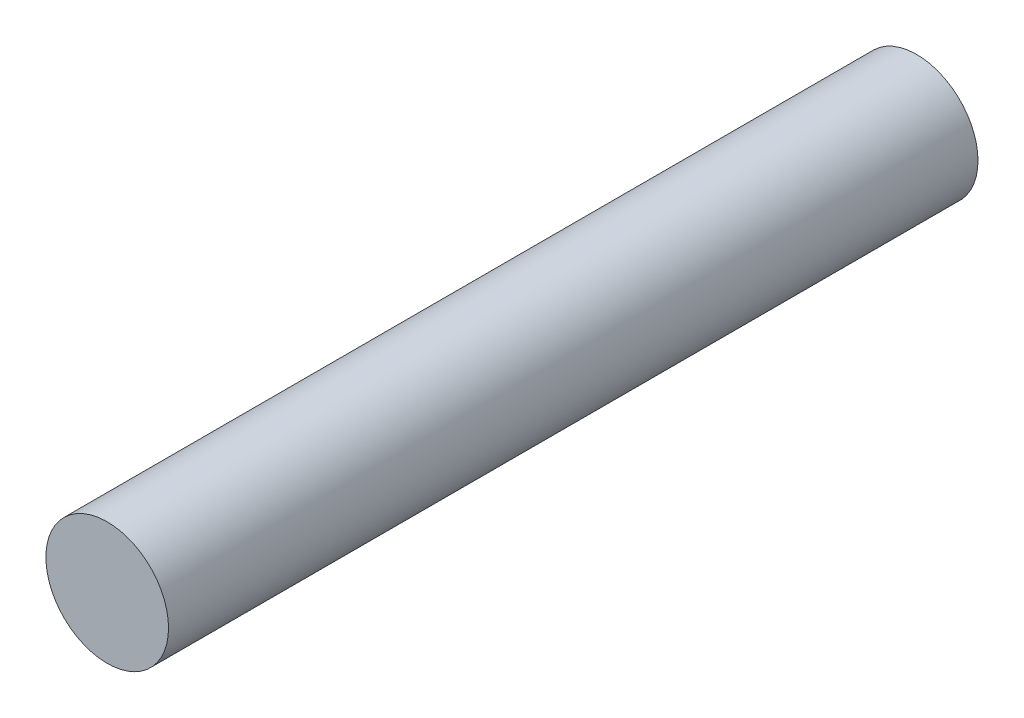
ISO-10303-21;
HEADER;
FILE_DESCRIPTION(('STEP AP214'),'2;1');
FILE_NAME('part.step','',(''),(''),'','','');
FILE_SCHEMA(('AUTOMOTIVE_DESIGN { 1 0 10303 214 1 1 1 1 }'));
ENDSEC;
DATA;
#1=APPLICATION_CONTEXT('core data for automotive mechanical design processes');
#2=APPLICATION_PROTOCOL_DEFINITION('international standard','automotive_design',2000,#1);
#3=PRODUCT_CONTEXT('',#1,'mechanical');
#4=PRODUCT('Part','Part','',(#3));
#5=PRODUCT_RELATED_PRODUCT_CATEGORY('part','',(#4));
#6=PRODUCT_DEFINITION_FORMATION('','',#4);
#7=PRODUCT_DEFINITION_CONTEXT('part definition',#1,'design');
#8=PRODUCT_DEFINITION('design','',#6,#7);
#9=PRODUCT_DEFINITION_SHAPE('','',#8);
#10=(LENGTH_UNIT() NAMED_UNIT(*) SI_UNIT(.MILLI.,.METRE.));
#11=(NAMED_UNIT(*) PLANE_ANGLE_UNIT() SI_UNIT($,.RADIAN.));
#12=(NAMED_UNIT(*) SI_UNIT($,.STERADIAN.) SOLID_ANGLE_UNIT());
#13=UNCERTAINTY_MEASURE_WITH_UNIT(LENGTH_MEASURE(1.E-05),#10,'distance_accuracy_value','');
#14=(GEOMETRIC_REPRESENTATION_CONTEXT(3) GLOBAL_UNCERTAINTY_ASSIGNED_CONTEXT((#13)) GLOBAL_UNIT_ASSIGNED_CONTEXT((#10,
#11,#12)) REPRESENTATION_CONTEXT('',''));
#15=CARTESIAN_POINT('',(0.,0.,0.));
#16=DIRECTION('',(0.,0.,1.));
#17=DIRECTION('',(1.,0.,0.));
#18=AXIS2_PLACEMENT_3D('',#15,#16,#17);
#19=CARTESIAN_POINT('',(0.,0.,33.));
#20=DIRECTION('',(0.,0.,-1.));
#21=DIRECTION('',(-1.,0.,0.));
#22=AXIS2_PLACEMENT_3D('',#19,#20,#21);
#23=CYLINDRICAL_SURFACE('',#22,2.5);
#24=CARTESIAN_POINT('',(0.,0.,33.));
#25=DIRECTION('',(0.,0.,1.));
#26=DIRECTION('',(1.,0.,0.));
#27=AXIS2_PLACEMENT_3D('',#24,#25,#26);
#28=CIRCLE('',#27,2.5);
#29=CARTESIAN_POINT('',(2.5,0.,33.));
#30=VERTEX_POINT('',#29);
#31=EDGE_CURVE('E10',#30,#30,#28,.T.);
#32=ORIENTED_EDGE('',*,*,#31,.F.);
#33=EDGE_LOOP('',(#32));
#34=FACE_BOUND('',#33,.T.);
#35=CARTESIAN_POINT('',(0.,0.,0.));
#36=DIRECTION('',(0.,0.,1.));
#37=DIRECTION('',(1.,0.,0.));
#38=AXIS2_PLACEMENT_3D('',#35,#36,#37);
#39=CIRCLE('',#38,2.5);
#40=CARTESIAN_POINT('',(2.5,0.,0.));
#41=VERTEX_POINT('',#40);
#42=EDGE_CURVE('E40',#41,#41,#39,.T.);
#43=ORIENTED_EDGE('',*,*,#42,.T.);
#44=EDGE_LOOP('',(#43));
#45=FACE_BOUND('',#44,.T.);
#46=ADVANCED_FACE('F37',(#34,#45),#23,.T.);
#47=CARTESIAN_POINT('',(0.,0.,33.));
#48=DIRECTION('',(0.,0.,1.));
#49=DIRECTION('',(1.,0.,0.));
#50=AXIS2_PLACEMENT_3D('',#47,#48,#49);
#51=PLANE('',#50);
#52=ORIENTED_EDGE('',*,*,#31,.T.);
#53=EDGE_LOOP('',(#52));
#54=FACE_BOUND('',#53,.T.);
#55=ADVANCED_FACE('F54',(#54),#51,.T.);
#56=CARTESIAN_POINT('',(0.,0.,0.));
#57=DIRECTION('',(0.,0.,1.));
#58=DIRECTION('',(1.,0.,0.));
#59=AXIS2_PLACEMENT_3D('',#56,#57,#58);
#60=PLANE('',#59);
#61=ORIENTED_EDGE('',*,*,#42,.F.);
#62=EDGE_LOOP('',(#61));
#63=FACE_BOUND('',#62,.T.);
#64=ADVANCED_FACE('F52',(#63),#60,.F.);
#65=CLOSED_SHELL('',(#46,#55,#64));
#66=MANIFOLD_SOLID_BREP('B2',#65);
#67=ADVANCED_BREP_SHAPE_REPRESENTATION('',(#18,#66),#14);
#68=SHAPE_DEFINITION_REPRESENTATION(#9,#67);
ENDSEC;
END-ISO-10303-21;
